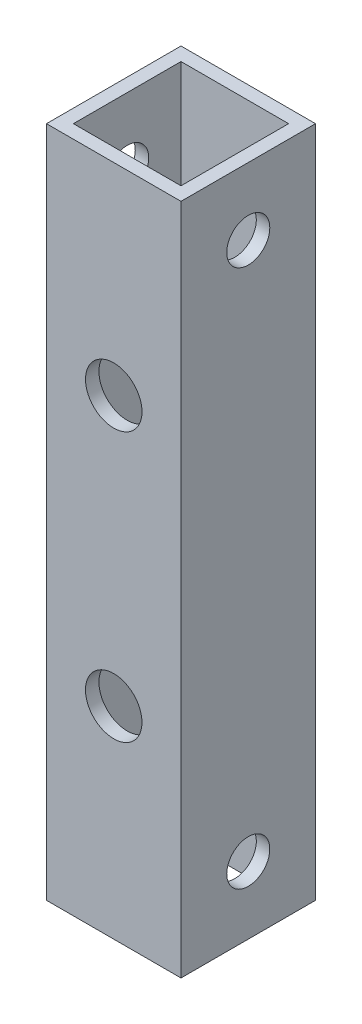
ISO-10303-21;
HEADER;
FILE_DESCRIPTION(('STEP AP214'),'2;1');
FILE_NAME('part.step','',(''),(''),'','','');
FILE_SCHEMA(('AUTOMOTIVE_DESIGN { 1 0 10303 214 1 1 1 1 }'));
ENDSEC;
DATA;
#1=APPLICATION_CONTEXT('core data for automotive mechanical design processes');
#2=APPLICATION_PROTOCOL_DEFINITION('international standard','automotive_design',2000,#1);
#3=PRODUCT_CONTEXT('',#1,'mechanical');
#4=PRODUCT('Part','Part','',(#3));
#5=PRODUCT_RELATED_PRODUCT_CATEGORY('part','',(#4));
#6=PRODUCT_DEFINITION_FORMATION('','',#4);
#7=PRODUCT_DEFINITION_CONTEXT('part definition',#1,'design');
#8=PRODUCT_DEFINITION('design','',#6,#7);
#9=PRODUCT_DEFINITION_SHAPE('','',#8);
#10=(LENGTH_UNIT() NAMED_UNIT(*) SI_UNIT(.MILLI.,.METRE.));
#11=(NAMED_UNIT(*) PLANE_ANGLE_UNIT() SI_UNIT($,.RADIAN.));
#12=(NAMED_UNIT(*) SI_UNIT($,.STERADIAN.) SOLID_ANGLE_UNIT());
#13=UNCERTAINTY_MEASURE_WITH_UNIT(LENGTH_MEASURE(1.E-05),#10,'distance_accuracy_value','');
#14=(GEOMETRIC_REPRESENTATION_CONTEXT(3) GLOBAL_UNCERTAINTY_ASSIGNED_CONTEXT((#13)) GLOBAL_UNIT_ASSIGNED_CONTEXT((#10,
#11,#12)) REPRESENTATION_CONTEXT('',''));
#15=CARTESIAN_POINT('',(0.,0.,0.));
#16=DIRECTION('',(0.,0.,1.));
#17=DIRECTION('',(1.,0.,0.));
#18=AXIS2_PLACEMENT_3D('',#15,#16,#17);
#19=CARTESIAN_POINT('',(0.,50.,0.));
#20=DIRECTION('',(0.,1.,0.));
#21=DIRECTION('',(0.,0.,1.));
#22=AXIS2_PLACEMENT_3D('',#19,#20,#21);
#23=PLANE('',#22);
#24=DIRECTION('',(0.,0.,-1.));
#25=VECTOR('',#24,1.);
#26=CARTESIAN_POINT('',(5.,50.,-5.));
#27=LINE('',#26,#25);
#28=CARTESIAN_POINT('',(5.,50.,5.));
#29=VERTEX_POINT('',#28);
#30=CARTESIAN_POINT('',(5.,50.,-5.));
#31=VERTEX_POINT('',#30);
#32=EDGE_CURVE('E164',#29,#31,#27,.T.);
#33=ORIENTED_EDGE('',*,*,#32,.T.);
#34=DIRECTION('',(-1.,0.,0.));
#35=VECTOR('',#34,1.);
#36=CARTESIAN_POINT('',(-5.,50.,-5.));
#37=LINE('',#36,#35);
#38=CARTESIAN_POINT('',(-5.,50.,-5.));
#39=VERTEX_POINT('',#38);
#40=EDGE_CURVE('E167',#31,#39,#37,.T.);
#41=ORIENTED_EDGE('',*,*,#40,.T.);
#42=DIRECTION('',(0.,0.,1.));
#43=VECTOR('',#42,1.);
#44=CARTESIAN_POINT('',(-5.,50.,-5.));
#45=LINE('',#44,#43);
#46=CARTESIAN_POINT('',(-5.,50.,5.));
#47=VERTEX_POINT('',#46);
#48=EDGE_CURVE('E170',#39,#47,#45,.T.);
#49=ORIENTED_EDGE('',*,*,#48,.T.);
#50=DIRECTION('',(1.,0.,0.));
#51=VECTOR('',#50,1.);
#52=CARTESIAN_POINT('',(-5.,50.,5.));
#53=LINE('',#52,#51);
#54=EDGE_CURVE('E172',#47,#29,#53,.T.);
#55=ORIENTED_EDGE('',*,*,#54,.T.);
#56=EDGE_LOOP('',(#33,#41,#49,#55));
#57=FACE_BOUND('',#56,.T.);
#58=DIRECTION('',(-1.,0.,0.));
#59=VECTOR('',#58,1.);
#60=CARTESIAN_POINT('',(-5.,50.,-4.));
#61=LINE('',#60,#59);
#62=CARTESIAN_POINT('',(4.,50.,-4.));
#63=VERTEX_POINT('',#62);
#64=CARTESIAN_POINT('',(-4.,50.,-4.));
#65=VERTEX_POINT('',#64);
#66=EDGE_CURVE('E134',#63,#65,#61,.T.);
#67=ORIENTED_EDGE('',*,*,#66,.F.);
#68=DIRECTION('',(0.,0.,-1.));
#69=VECTOR('',#68,1.);
#70=CARTESIAN_POINT('',(4.,50.,-5.));
#71=LINE('',#70,#69);
#72=CARTESIAN_POINT('',(4.,50.,4.));
#73=VERTEX_POINT('',#72);
#74=EDGE_CURVE('E126',#73,#63,#71,.T.);
#75=ORIENTED_EDGE('',*,*,#74,.F.);
#76=DIRECTION('',(1.,0.,0.));
#77=VECTOR('',#76,1.);
#78=CARTESIAN_POINT('',(-5.,50.,4.));
#79=LINE('',#78,#77);
#80=CARTESIAN_POINT('',(-4.,50.,4.));
#81=VERTEX_POINT('',#80);
#82=EDGE_CURVE('E148',#81,#73,#79,.T.);
#83=ORIENTED_EDGE('',*,*,#82,.F.);
#84=DIRECTION('',(0.,0.,1.));
#85=VECTOR('',#84,1.);
#86=CARTESIAN_POINT('',(-4.,50.,-5.));
#87=LINE('',#86,#85);
#88=EDGE_CURVE('E146',#65,#81,#87,.T.);
#89=ORIENTED_EDGE('',*,*,#88,.F.);
#90=EDGE_LOOP('',(#67,#75,#83,#89));
#91=FACE_BOUND('',#90,.T.);
#92=ADVANCED_FACE('F59',(#57,#91),#23,.T.);
#93=CARTESIAN_POINT('',(0.,0.,0.));
#94=DIRECTION('',(0.,1.,0.));
#95=DIRECTION('',(0.,0.,1.));
#96=AXIS2_PLACEMENT_3D('',#93,#94,#95);
#97=PLANE('',#96);
#98=DIRECTION('',(0.,0.,-1.));
#99=VECTOR('',#98,1.);
#100=CARTESIAN_POINT('',(5.,0.,-5.));
#101=LINE('',#100,#99);
#102=CARTESIAN_POINT('',(5.,0.,5.));
#103=VERTEX_POINT('',#102);
#104=CARTESIAN_POINT('',(5.,0.,-5.));
#105=VERTEX_POINT('',#104);
#106=EDGE_CURVE('E142',#103,#105,#101,.T.);
#107=ORIENTED_EDGE('',*,*,#106,.F.);
#108=DIRECTION('',(1.,0.,0.));
#109=VECTOR('',#108,1.);
#110=CARTESIAN_POINT('',(-5.,0.,5.));
#111=LINE('',#110,#109);
#112=CARTESIAN_POINT('',(-5.,0.,5.));
#113=VERTEX_POINT('',#112);
#114=EDGE_CURVE('E168',#113,#103,#111,.T.);
#115=ORIENTED_EDGE('',*,*,#114,.F.);
#116=DIRECTION('',(0.,0.,1.));
#117=VECTOR('',#116,1.);
#118=CARTESIAN_POINT('',(-5.,0.,-5.));
#119=LINE('',#118,#117);
#120=CARTESIAN_POINT('',(-5.,0.,-5.));
#121=VERTEX_POINT('',#120);
#122=EDGE_CURVE('E179',#121,#113,#119,.T.);
#123=ORIENTED_EDGE('',*,*,#122,.F.);
#124=DIRECTION('',(-1.,0.,0.));
#125=VECTOR('',#124,1.);
#126=CARTESIAN_POINT('',(-5.,0.,-5.));
#127=LINE('',#126,#125);
#128=EDGE_CURVE('E177',#105,#121,#127,.T.);
#129=ORIENTED_EDGE('',*,*,#128,.F.);
#130=EDGE_LOOP('',(#107,#115,#123,#129));
#131=FACE_BOUND('',#130,.T.);
#132=DIRECTION('',(0.,0.,-1.));
#133=VECTOR('',#132,1.);
#134=CARTESIAN_POINT('',(4.,0.,-5.));
#135=LINE('',#134,#133);
#136=CARTESIAN_POINT('',(4.,0.,4.));
#137=VERTEX_POINT('',#136);
#138=CARTESIAN_POINT('',(4.,0.,-4.));
#139=VERTEX_POINT('',#138);
#140=EDGE_CURVE('E84',#137,#139,#135,.T.);
#141=ORIENTED_EDGE('',*,*,#140,.T.);
#142=DIRECTION('',(-1.,0.,0.));
#143=VECTOR('',#142,1.);
#144=CARTESIAN_POINT('',(-5.,0.,-4.));
#145=LINE('',#144,#143);
#146=CARTESIAN_POINT('',(-4.,0.,-4.));
#147=VERTEX_POINT('',#146);
#148=EDGE_CURVE('E141',#139,#147,#145,.T.);
#149=ORIENTED_EDGE('',*,*,#148,.T.);
#150=DIRECTION('',(0.,0.,1.));
#151=VECTOR('',#150,1.);
#152=CARTESIAN_POINT('',(-4.,0.,-5.));
#153=LINE('',#152,#151);
#154=CARTESIAN_POINT('',(-4.,0.,4.));
#155=VERTEX_POINT('',#154);
#156=EDGE_CURVE('E156',#147,#155,#153,.T.);
#157=ORIENTED_EDGE('',*,*,#156,.T.);
#158=DIRECTION('',(1.,0.,0.));
#159=VECTOR('',#158,1.);
#160=CARTESIAN_POINT('',(-5.,0.,4.));
#161=LINE('',#160,#159);
#162=EDGE_CURVE('E135',#155,#137,#161,.T.);
#163=ORIENTED_EDGE('',*,*,#162,.T.);
#164=EDGE_LOOP('',(#141,#149,#157,#163));
#165=FACE_BOUND('',#164,.T.);
#166=ADVANCED_FACE('F256',(#131,#165),#97,.F.);
#167=CARTESIAN_POINT('',(5.,50.,-5.));
#168=DIRECTION('',(-1.,0.,0.));
#169=DIRECTION('',(0.,0.,1.));
#170=AXIS2_PLACEMENT_3D('',#167,#168,#169);
#171=PLANE('',#170);
#172=CARTESIAN_POINT('',(5.,45.,0.));
#173=DIRECTION('',(1.,0.,0.));
#174=DIRECTION('',(0.,0.,-1.));
#175=AXIS2_PLACEMENT_3D('',#172,#173,#174);
#176=CIRCLE('',#175,1.6);
#177=CARTESIAN_POINT('',(5.,45.,-1.6));
#178=VERTEX_POINT('',#177);
#179=EDGE_CURVE('E224',#178,#178,#176,.T.);
#180=ORIENTED_EDGE('',*,*,#179,.F.);
#181=EDGE_LOOP('',(#180));
#182=FACE_BOUND('',#181,.T.);
#183=CARTESIAN_POINT('',(5.,5.,0.));
#184=DIRECTION('',(1.,0.,0.));
#185=DIRECTION('',(0.,0.,1.));
#186=AXIS2_PLACEMENT_3D('',#183,#184,#185);
#187=CIRCLE('',#186,1.6);
#188=CARTESIAN_POINT('',(5.,5.,1.6));
#189=VERTEX_POINT('',#188);
#190=EDGE_CURVE('E221',#189,#189,#187,.T.);
#191=ORIENTED_EDGE('',*,*,#190,.F.);
#192=EDGE_LOOP('',(#191));
#193=FACE_BOUND('',#192,.T.);
#194=ORIENTED_EDGE('',*,*,#106,.T.);
#195=DIRECTION('',(0.,-1.,0.));
#196=VECTOR('',#195,1.);
#197=CARTESIAN_POINT('',(5.,50.,-5.));
#198=LINE('',#197,#196);
#199=EDGE_CURVE('E12',#31,#105,#198,.T.);
#200=ORIENTED_EDGE('',*,*,#199,.F.);
#201=ORIENTED_EDGE('',*,*,#32,.F.);
#202=DIRECTION('',(0.,-1.,0.));
#203=VECTOR('',#202,1.);
#204=CARTESIAN_POINT('',(5.,50.,5.));
#205=LINE('',#204,#203);
#206=EDGE_CURVE('E174',#29,#103,#205,.T.);
#207=ORIENTED_EDGE('',*,*,#206,.T.);
#208=EDGE_LOOP('',(#194,#200,#201,#207));
#209=FACE_BOUND('',#208,.T.);
#210=ADVANCED_FACE('F61',(#182,#193,#209),#171,.F.);
#211=CARTESIAN_POINT('',(-5.,50.,-5.));
#212=DIRECTION('',(0.,0.,1.));
#213=DIRECTION('',(1.,0.,0.));
#214=AXIS2_PLACEMENT_3D('',#211,#212,#213);
#215=PLANE('',#214);
#216=CARTESIAN_POINT('',(0.,35.,-5.));
#217=DIRECTION('',(0.,0.,1.));
#218=DIRECTION('',(1.,0.,0.));
#219=AXIS2_PLACEMENT_3D('',#216,#217,#218);
#220=CIRCLE('',#219,2.1);
#221=CARTESIAN_POINT('',(2.1,35.,-5.));
#222=VERTEX_POINT('',#221);
#223=EDGE_CURVE('E199',#222,#222,#220,.T.);
#224=ORIENTED_EDGE('',*,*,#223,.T.);
#225=EDGE_LOOP('',(#224));
#226=FACE_BOUND('',#225,.T.);
#227=CARTESIAN_POINT('',(0.,15.,-5.));
#228=DIRECTION('',(0.,0.,1.));
#229=DIRECTION('',(-1.,0.,0.));
#230=AXIS2_PLACEMENT_3D('',#227,#228,#229);
#231=CIRCLE('',#230,2.1);
#232=CARTESIAN_POINT('',(-2.1,15.,-5.));
#233=VERTEX_POINT('',#232);
#234=EDGE_CURVE('E210',#233,#233,#231,.T.);
#235=ORIENTED_EDGE('',*,*,#234,.T.);
#236=EDGE_LOOP('',(#235));
#237=FACE_BOUND('',#236,.T.);
#238=ORIENTED_EDGE('',*,*,#128,.T.);
#239=DIRECTION('',(0.,-1.,0.));
#240=VECTOR('',#239,1.);
#241=CARTESIAN_POINT('',(-5.,50.,-5.));
#242=LINE('',#241,#240);
#243=EDGE_CURVE('E68',#39,#121,#242,.T.);
#244=ORIENTED_EDGE('',*,*,#243,.F.);
#245=ORIENTED_EDGE('',*,*,#40,.F.);
#246=ORIENTED_EDGE('',*,*,#199,.T.);
#247=EDGE_LOOP('',(#238,#244,#245,#246));
#248=FACE_BOUND('',#247,.T.);
#249=ADVANCED_FACE('F255',(#226,#237,#248),#215,.F.);
#250=CARTESIAN_POINT('',(-5.,50.,-5.));
#251=DIRECTION('',(1.,0.,0.));
#252=DIRECTION('',(0.,0.,-1.));
#253=AXIS2_PLACEMENT_3D('',#250,#251,#252);
#254=PLANE('',#253);
#255=CARTESIAN_POINT('',(-5.,45.,0.));
#256=DIRECTION('',(1.,0.,0.));
#257=DIRECTION('',(0.,0.,-1.));
#258=AXIS2_PLACEMENT_3D('',#255,#256,#257);
#259=CIRCLE('',#258,1.6);
#260=CARTESIAN_POINT('',(-5.,45.,-1.6));
#261=VERTEX_POINT('',#260);
#262=EDGE_CURVE('E193',#261,#261,#259,.T.);
#263=ORIENTED_EDGE('',*,*,#262,.T.);
#264=EDGE_LOOP('',(#263));
#265=FACE_BOUND('',#264,.T.);
#266=CARTESIAN_POINT('',(-5.,5.,0.));
#267=DIRECTION('',(1.,0.,0.));
#268=DIRECTION('',(0.,0.,1.));
#269=AXIS2_PLACEMENT_3D('',#266,#267,#268);
#270=CIRCLE('',#269,1.6);
#271=CARTESIAN_POINT('',(-5.,5.,1.6));
#272=VERTEX_POINT('',#271);
#273=EDGE_CURVE('E227',#272,#272,#270,.T.);
#274=ORIENTED_EDGE('',*,*,#273,.T.);
#275=EDGE_LOOP('',(#274));
#276=FACE_BOUND('',#275,.T.);
#277=ORIENTED_EDGE('',*,*,#122,.T.);
#278=DIRECTION('',(0.,-1.,0.));
#279=VECTOR('',#278,1.);
#280=CARTESIAN_POINT('',(-5.,50.,5.));
#281=LINE('',#280,#279);
#282=EDGE_CURVE('E184',#47,#113,#281,.T.);
#283=ORIENTED_EDGE('',*,*,#282,.F.);
#284=ORIENTED_EDGE('',*,*,#48,.F.);
#285=ORIENTED_EDGE('',*,*,#243,.T.);
#286=EDGE_LOOP('',(#277,#283,#284,#285));
#287=FACE_BOUND('',#286,.T.);
#288=ADVANCED_FACE('F274',(#265,#276,#287),#254,.F.);
#289=CARTESIAN_POINT('',(-5.,50.,5.));
#290=DIRECTION('',(0.,0.,-1.));
#291=DIRECTION('',(-1.,0.,0.));
#292=AXIS2_PLACEMENT_3D('',#289,#290,#291);
#293=PLANE('',#292);
#294=CARTESIAN_POINT('',(0.,35.,5.));
#295=DIRECTION('',(0.,0.,1.));
#296=DIRECTION('',(1.,0.,0.));
#297=AXIS2_PLACEMENT_3D('',#294,#295,#296);
#298=CIRCLE('',#297,2.1);
#299=CARTESIAN_POINT('',(2.1,35.,5.));
#300=VERTEX_POINT('',#299);
#301=EDGE_CURVE('E205',#300,#300,#298,.T.);
#302=ORIENTED_EDGE('',*,*,#301,.F.);
#303=EDGE_LOOP('',(#302));
#304=FACE_BOUND('',#303,.T.);
#305=CARTESIAN_POINT('',(0.,15.,5.));
#306=DIRECTION('',(0.,0.,1.));
#307=DIRECTION('',(-1.,0.,0.));
#308=AXIS2_PLACEMENT_3D('',#305,#306,#307);
#309=CIRCLE('',#308,2.1);
#310=CARTESIAN_POINT('',(-2.1,15.,5.));
#311=VERTEX_POINT('',#310);
#312=EDGE_CURVE('E215',#311,#311,#309,.T.);
#313=ORIENTED_EDGE('',*,*,#312,.F.);
#314=EDGE_LOOP('',(#313));
#315=FACE_BOUND('',#314,.T.);
#316=ORIENTED_EDGE('',*,*,#114,.T.);
#317=ORIENTED_EDGE('',*,*,#206,.F.);
#318=ORIENTED_EDGE('',*,*,#54,.F.);
#319=ORIENTED_EDGE('',*,*,#282,.T.);
#320=EDGE_LOOP('',(#316,#317,#318,#319));
#321=FACE_BOUND('',#320,.T.);
#322=ADVANCED_FACE('F241',(#304,#315,#321),#293,.F.);
#323=CARTESIAN_POINT('',(4.,50.,-5.));
#324=DIRECTION('',(-1.,0.,0.));
#325=DIRECTION('',(0.,0.,1.));
#326=AXIS2_PLACEMENT_3D('',#323,#324,#325);
#327=PLANE('',#326);
#328=CARTESIAN_POINT('',(4.,45.,0.));
#329=DIRECTION('',(-1.,0.,0.));
#330=DIRECTION('',(0.,0.,1.));
#331=AXIS2_PLACEMENT_3D('',#328,#329,#330);
#332=CIRCLE('',#331,1.6);
#333=CARTESIAN_POINT('',(4.,45.,1.6));
#334=VERTEX_POINT('',#333);
#335=EDGE_CURVE('E154',#334,#334,#332,.T.);
#336=ORIENTED_EDGE('',*,*,#335,.F.);
#337=EDGE_LOOP('',(#336));
#338=FACE_BOUND('',#337,.T.);
#339=CARTESIAN_POINT('',(4.,5.,0.));
#340=DIRECTION('',(-1.,0.,0.));
#341=DIRECTION('',(0.,0.,1.));
#342=AXIS2_PLACEMENT_3D('',#339,#340,#341);
#343=CIRCLE('',#342,1.6);
#344=CARTESIAN_POINT('',(4.,5.,1.6));
#345=VERTEX_POINT('',#344);
#346=EDGE_CURVE('E192',#345,#345,#343,.T.);
#347=ORIENTED_EDGE('',*,*,#346,.F.);
#348=EDGE_LOOP('',(#347));
#349=FACE_BOUND('',#348,.T.);
#350=ORIENTED_EDGE('',*,*,#140,.F.);
#351=DIRECTION('',(0.,-1.,0.));
#352=VECTOR('',#351,1.);
#353=CARTESIAN_POINT('',(4.,50.,4.));
#354=LINE('',#353,#352);
#355=EDGE_CURVE('E130',#73,#137,#354,.T.);
#356=ORIENTED_EDGE('',*,*,#355,.F.);
#357=ORIENTED_EDGE('',*,*,#74,.T.);
#358=DIRECTION('',(0.,-1.,0.));
#359=VECTOR('',#358,1.);
#360=CARTESIAN_POINT('',(4.,50.,-4.));
#361=LINE('',#360,#359);
#362=EDGE_CURVE('E129',#63,#139,#361,.T.);
#363=ORIENTED_EDGE('',*,*,#362,.T.);
#364=EDGE_LOOP('',(#350,#356,#357,#363));
#365=FACE_BOUND('',#364,.T.);
#366=ADVANCED_FACE('F128',(#338,#349,#365),#327,.T.);
#367=CARTESIAN_POINT('',(-5.,50.,-4.));
#368=DIRECTION('',(0.,0.,1.));
#369=DIRECTION('',(1.,0.,0.));
#370=AXIS2_PLACEMENT_3D('',#367,#368,#369);
#371=PLANE('',#370);
#372=CARTESIAN_POINT('',(0.,35.,-4.));
#373=DIRECTION('',(0.,0.,1.));
#374=DIRECTION('',(1.,0.,0.));
#375=AXIS2_PLACEMENT_3D('',#372,#373,#374);
#376=CIRCLE('',#375,2.1);
#377=CARTESIAN_POINT('',(2.1,35.,-4.));
#378=VERTEX_POINT('',#377);
#379=EDGE_CURVE('E218',#378,#378,#376,.T.);
#380=ORIENTED_EDGE('',*,*,#379,.F.);
#381=EDGE_LOOP('',(#380));
#382=FACE_BOUND('',#381,.T.);
#383=CARTESIAN_POINT('',(0.,15.,-4.));
#384=DIRECTION('',(0.,0.,1.));
#385=DIRECTION('',(1.,0.,0.));
#386=AXIS2_PLACEMENT_3D('',#383,#384,#385);
#387=CIRCLE('',#386,2.1);
#388=CARTESIAN_POINT('',(2.1,15.,-4.));
#389=VERTEX_POINT('',#388);
#390=EDGE_CURVE('E198',#389,#389,#387,.T.);
#391=ORIENTED_EDGE('',*,*,#390,.F.);
#392=EDGE_LOOP('',(#391));
#393=FACE_BOUND('',#392,.T.);
#394=ORIENTED_EDGE('',*,*,#148,.F.);
#395=ORIENTED_EDGE('',*,*,#362,.F.);
#396=ORIENTED_EDGE('',*,*,#66,.T.);
#397=DIRECTION('',(0.,-1.,0.));
#398=VECTOR('',#397,1.);
#399=CARTESIAN_POINT('',(-4.,50.,-4.));
#400=LINE('',#399,#398);
#401=EDGE_CURVE('E143',#65,#147,#400,.T.);
#402=ORIENTED_EDGE('',*,*,#401,.T.);
#403=EDGE_LOOP('',(#394,#395,#396,#402));
#404=FACE_BOUND('',#403,.T.);
#405=ADVANCED_FACE('F138',(#382,#393,#404),#371,.T.);
#406=CARTESIAN_POINT('',(-4.,50.,-5.));
#407=DIRECTION('',(1.,0.,0.));
#408=DIRECTION('',(0.,0.,-1.));
#409=AXIS2_PLACEMENT_3D('',#406,#407,#408);
#410=PLANE('',#409);
#411=CARTESIAN_POINT('',(-4.,45.,0.));
#412=DIRECTION('',(1.,0.,0.));
#413=DIRECTION('',(0.,0.,-1.));
#414=AXIS2_PLACEMENT_3D('',#411,#412,#413);
#415=CIRCLE('',#414,1.6);
#416=CARTESIAN_POINT('',(-4.,45.,-1.6));
#417=VERTEX_POINT('',#416);
#418=EDGE_CURVE('E194',#417,#417,#415,.T.);
#419=ORIENTED_EDGE('',*,*,#418,.F.);
#420=EDGE_LOOP('',(#419));
#421=FACE_BOUND('',#420,.T.);
#422=CARTESIAN_POINT('',(-4.,5.,0.));
#423=DIRECTION('',(1.,0.,0.));
#424=DIRECTION('',(0.,0.,-1.));
#425=AXIS2_PLACEMENT_3D('',#422,#423,#424);
#426=CIRCLE('',#425,1.6);
#427=CARTESIAN_POINT('',(-4.,5.,-1.6));
#428=VERTEX_POINT('',#427);
#429=EDGE_CURVE('E189',#428,#428,#426,.T.);
#430=ORIENTED_EDGE('',*,*,#429,.F.);
#431=EDGE_LOOP('',(#430));
#432=FACE_BOUND('',#431,.T.);
#433=ORIENTED_EDGE('',*,*,#156,.F.);
#434=ORIENTED_EDGE('',*,*,#401,.F.);
#435=ORIENTED_EDGE('',*,*,#88,.T.);
#436=DIRECTION('',(0.,-1.,0.));
#437=VECTOR('',#436,1.);
#438=CARTESIAN_POINT('',(-4.,50.,4.));
#439=LINE('',#438,#437);
#440=EDGE_CURVE('E76',#81,#155,#439,.T.);
#441=ORIENTED_EDGE('',*,*,#440,.T.);
#442=EDGE_LOOP('',(#433,#434,#435,#441));
#443=FACE_BOUND('',#442,.T.);
#444=ADVANCED_FACE('F294',(#421,#432,#443),#410,.T.);
#445=CARTESIAN_POINT('',(-5.,50.,4.));
#446=DIRECTION('',(0.,0.,-1.));
#447=DIRECTION('',(-1.,0.,0.));
#448=AXIS2_PLACEMENT_3D('',#445,#446,#447);
#449=PLANE('',#448);
#450=CARTESIAN_POINT('',(0.,35.,4.));
#451=DIRECTION('',(0.,0.,-1.));
#452=DIRECTION('',(-1.,0.,0.));
#453=AXIS2_PLACEMENT_3D('',#450,#451,#452);
#454=CIRCLE('',#453,2.1);
#455=CARTESIAN_POINT('',(-2.1,35.,4.));
#456=VERTEX_POINT('',#455);
#457=EDGE_CURVE('E63',#456,#456,#454,.T.);
#458=ORIENTED_EDGE('',*,*,#457,.F.);
#459=EDGE_LOOP('',(#458));
#460=FACE_BOUND('',#459,.T.);
#461=CARTESIAN_POINT('',(0.,15.,4.));
#462=DIRECTION('',(0.,0.,-1.));
#463=DIRECTION('',(-1.,0.,0.));
#464=AXIS2_PLACEMENT_3D('',#461,#462,#463);
#465=CIRCLE('',#464,2.1);
#466=CARTESIAN_POINT('',(-2.1,15.,4.));
#467=VERTEX_POINT('',#466);
#468=EDGE_CURVE('E196',#467,#467,#465,.T.);
#469=ORIENTED_EDGE('',*,*,#468,.F.);
#470=EDGE_LOOP('',(#469));
#471=FACE_BOUND('',#470,.T.);
#472=ORIENTED_EDGE('',*,*,#162,.F.);
#473=ORIENTED_EDGE('',*,*,#440,.F.);
#474=ORIENTED_EDGE('',*,*,#82,.T.);
#475=ORIENTED_EDGE('',*,*,#355,.T.);
#476=EDGE_LOOP('',(#472,#473,#474,#475));
#477=FACE_BOUND('',#476,.T.);
#478=ADVANCED_FACE('F298',(#460,#471,#477),#449,.T.);
#479=CARTESIAN_POINT('',(-5.,5.,0.));
#480=DIRECTION('',(1.,0.,0.));
#481=DIRECTION('',(0.,0.,-1.));
#482=AXIS2_PLACEMENT_3D('',#479,#480,#481);
#483=CYLINDRICAL_SURFACE('',#482,1.6);
#484=ORIENTED_EDGE('',*,*,#429,.T.);
#485=EDGE_LOOP('',(#484));
#486=FACE_BOUND('',#485,.T.);
#487=ORIENTED_EDGE('',*,*,#273,.F.);
#488=EDGE_LOOP('',(#487));
#489=FACE_BOUND('',#488,.T.);
#490=ADVANCED_FACE('F250',(#486,#489),#483,.F.);
#491=CARTESIAN_POINT('',(-5.,45.,0.));
#492=DIRECTION('',(1.,0.,0.));
#493=DIRECTION('',(0.,0.,-1.));
#494=AXIS2_PLACEMENT_3D('',#491,#492,#493);
#495=CYLINDRICAL_SURFACE('',#494,1.6);
#496=ORIENTED_EDGE('',*,*,#418,.T.);
#497=EDGE_LOOP('',(#496));
#498=FACE_BOUND('',#497,.T.);
#499=ORIENTED_EDGE('',*,*,#262,.F.);
#500=EDGE_LOOP('',(#499));
#501=FACE_BOUND('',#500,.T.);
#502=ADVANCED_FACE('F248',(#498,#501),#495,.F.);
#503=ORIENTED_EDGE('',*,*,#346,.T.);
#504=EDGE_LOOP('',(#503));
#505=FACE_BOUND('',#504,.T.);
#506=ORIENTED_EDGE('',*,*,#190,.T.);
#507=EDGE_LOOP('',(#506));
#508=FACE_BOUND('',#507,.T.);
#509=ADVANCED_FACE('F245',(#505,#508),#483,.F.);
#510=ORIENTED_EDGE('',*,*,#335,.T.);
#511=EDGE_LOOP('',(#510));
#512=FACE_BOUND('',#511,.T.);
#513=ORIENTED_EDGE('',*,*,#179,.T.);
#514=EDGE_LOOP('',(#513));
#515=FACE_BOUND('',#514,.T.);
#516=ADVANCED_FACE('F236',(#512,#515),#495,.F.);
#517=CARTESIAN_POINT('',(0.,15.,-5.));
#518=DIRECTION('',(0.,0.,1.));
#519=DIRECTION('',(1.,0.,0.));
#520=AXIS2_PLACEMENT_3D('',#517,#518,#519);
#521=CYLINDRICAL_SURFACE('',#520,2.1);
#522=ORIENTED_EDGE('',*,*,#468,.T.);
#523=EDGE_LOOP('',(#522));
#524=FACE_BOUND('',#523,.T.);
#525=ORIENTED_EDGE('',*,*,#312,.T.);
#526=EDGE_LOOP('',(#525));
#527=FACE_BOUND('',#526,.T.);
#528=ADVANCED_FACE('F308',(#524,#527),#521,.F.);
#529=CARTESIAN_POINT('',(0.,35.,-5.));
#530=DIRECTION('',(0.,0.,1.));
#531=DIRECTION('',(1.,0.,0.));
#532=AXIS2_PLACEMENT_3D('',#529,#530,#531);
#533=CYLINDRICAL_SURFACE('',#532,2.1);
#534=ORIENTED_EDGE('',*,*,#457,.T.);
#535=EDGE_LOOP('',(#534));
#536=FACE_BOUND('',#535,.T.);
#537=ORIENTED_EDGE('',*,*,#301,.T.);
#538=EDGE_LOOP('',(#537));
#539=FACE_BOUND('',#538,.T.);
#540=ADVANCED_FACE('F311',(#536,#539),#533,.F.);
#541=ORIENTED_EDGE('',*,*,#390,.T.);
#542=EDGE_LOOP('',(#541));
#543=FACE_BOUND('',#542,.T.);
#544=ORIENTED_EDGE('',*,*,#234,.F.);
#545=EDGE_LOOP('',(#544));
#546=FACE_BOUND('',#545,.T.);
#547=ADVANCED_FACE('F312',(#543,#546),#521,.F.);
#548=ORIENTED_EDGE('',*,*,#379,.T.);
#549=EDGE_LOOP('',(#548));
#550=FACE_BOUND('',#549,.T.);
#551=ORIENTED_EDGE('',*,*,#223,.F.);
#552=EDGE_LOOP('',(#551));
#553=FACE_BOUND('',#552,.T.);
#554=ADVANCED_FACE('F315',(#550,#553),#533,.F.);
#555=CLOSED_SHELL('',(#92,#166,#210,#249,#288,#322,#366,#405,#444,#478,#490,#502,#509,#516,#528,
#540,#547,#554));
#556=MANIFOLD_SOLID_BREP('B2',#555);
#557=ADVANCED_BREP_SHAPE_REPRESENTATION('',(#18,#556),#14);
#558=SHAPE_DEFINITION_REPRESENTATION(#9,#557);
ENDSEC;
END-ISO-10303-21;
